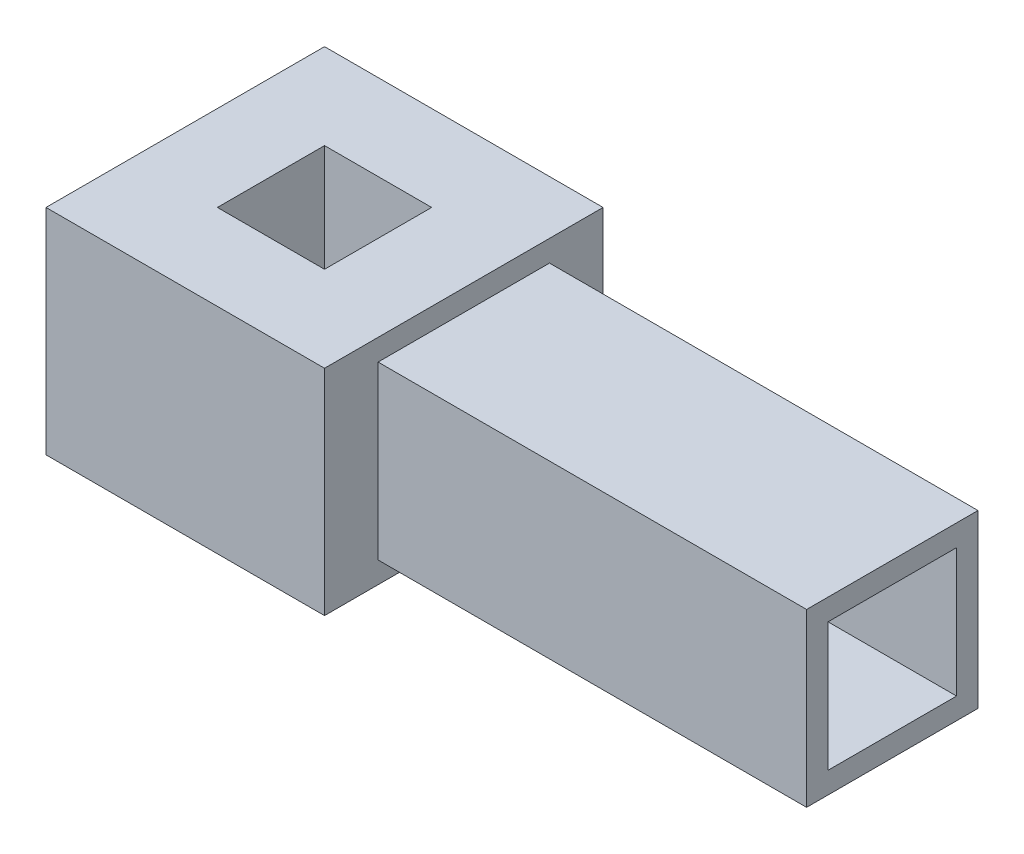
ISO-10303-21;
HEADER;
FILE_DESCRIPTION(('STEP AP214'),'2;1');
FILE_NAME('part.step','',(''),(''),'','','');
FILE_SCHEMA(('AUTOMOTIVE_DESIGN { 1 0 10303 214 1 1 1 1 }'));
ENDSEC;
DATA;
#1=APPLICATION_CONTEXT('core data for automotive mechanical design processes');
#2=APPLICATION_PROTOCOL_DEFINITION('international standard','automotive_design',2000,#1);
#3=PRODUCT_CONTEXT('',#1,'mechanical');
#4=PRODUCT('Part','Part','',(#3));
#5=PRODUCT_RELATED_PRODUCT_CATEGORY('part','',(#4));
#6=PRODUCT_DEFINITION_FORMATION('','',#4);
#7=PRODUCT_DEFINITION_CONTEXT('part definition',#1,'design');
#8=PRODUCT_DEFINITION('design','',#6,#7);
#9=PRODUCT_DEFINITION_SHAPE('','',#8);
#10=(LENGTH_UNIT() NAMED_UNIT(*) SI_UNIT(.MILLI.,.METRE.));
#11=(NAMED_UNIT(*) PLANE_ANGLE_UNIT() SI_UNIT($,.RADIAN.));
#12=(NAMED_UNIT(*) SI_UNIT($,.STERADIAN.) SOLID_ANGLE_UNIT());
#13=UNCERTAINTY_MEASURE_WITH_UNIT(LENGTH_MEASURE(1.E-05),#10,'distance_accuracy_value','');
#14=(GEOMETRIC_REPRESENTATION_CONTEXT(3) GLOBAL_UNCERTAINTY_ASSIGNED_CONTEXT((#13)) GLOBAL_UNIT_ASSIGNED_CONTEXT((#10,
#11,#12)) REPRESENTATION_CONTEXT('',''));
#15=CARTESIAN_POINT('',(0.,0.,0.));
#16=DIRECTION('',(0.,0.,1.));
#17=DIRECTION('',(1.,0.,0.));
#18=AXIS2_PLACEMENT_3D('',#15,#16,#17);
#19=CARTESIAN_POINT('',(32.5,50.,-32.5));
#20=DIRECTION('',(-1.,0.,0.));
#21=DIRECTION('',(0.,0.,1.));
#22=AXIS2_PLACEMENT_3D('',#19,#20,#21);
#23=PLANE('',#22);
#24=DIRECTION('',(0.,0.,-1.));
#25=VECTOR('',#24,1.);
#26=CARTESIAN_POINT('',(32.5,0.,-32.5));
#27=LINE('',#26,#25);
#28=CARTESIAN_POINT('',(32.5,0.,32.5));
#29=VERTEX_POINT('',#28);
#30=CARTESIAN_POINT('',(32.5,0.,-32.5));
#31=VERTEX_POINT('',#30);
#32=EDGE_CURVE('E256',#29,#31,#27,.T.);
#33=ORIENTED_EDGE('',*,*,#32,.T.);
#34=DIRECTION('',(0.,-1.,0.));
#35=VECTOR('',#34,1.);
#36=CARTESIAN_POINT('',(32.5,50.,-32.5));
#37=LINE('',#36,#35);
#38=CARTESIAN_POINT('',(32.5,50.,-32.5));
#39=VERTEX_POINT('',#38);
#40=EDGE_CURVE('E262',#39,#31,#37,.T.);
#41=ORIENTED_EDGE('',*,*,#40,.F.);
#42=DIRECTION('',(0.,0.,-1.));
#43=VECTOR('',#42,1.);
#44=CARTESIAN_POINT('',(32.5,50.,-32.5));
#45=LINE('',#44,#43);
#46=CARTESIAN_POINT('',(32.5,50.,32.5));
#47=VERTEX_POINT('',#46);
#48=EDGE_CURVE('E260',#47,#39,#45,.T.);
#49=ORIENTED_EDGE('',*,*,#48,.F.);
#50=DIRECTION('',(0.,-1.,0.));
#51=VECTOR('',#50,1.);
#52=CARTESIAN_POINT('',(32.5,50.,32.5));
#53=LINE('',#52,#51);
#54=EDGE_CURVE('E272',#47,#29,#53,.T.);
#55=ORIENTED_EDGE('',*,*,#54,.T.);
#56=EDGE_LOOP('',(#33,#41,#49,#55));
#57=FACE_BOUND('',#56,.T.);
#58=DIRECTION('',(0.,1.,0.));
#59=VECTOR('',#58,1.);
#60=CARTESIAN_POINT('',(32.5,45.,-20.));
#61=LINE('',#60,#59);
#62=CARTESIAN_POINT('',(32.5,5.,-20.));
#63=VERTEX_POINT('',#62);
#64=CARTESIAN_POINT('',(32.5,45.,-20.));
#65=VERTEX_POINT('',#64);
#66=EDGE_CURVE('E169',#63,#65,#61,.T.);
#67=ORIENTED_EDGE('',*,*,#66,.F.);
#68=DIRECTION('',(0.,0.,-1.));
#69=VECTOR('',#68,1.);
#70=CARTESIAN_POINT('',(32.5,5.,20.));
#71=LINE('',#70,#69);
#72=CARTESIAN_POINT('',(32.5,5.,20.));
#73=VERTEX_POINT('',#72);
#74=EDGE_CURVE('E197',#73,#63,#71,.T.);
#75=ORIENTED_EDGE('',*,*,#74,.F.);
#76=DIRECTION('',(0.,-1.,0.));
#77=VECTOR('',#76,1.);
#78=CARTESIAN_POINT('',(32.5,45.,20.));
#79=LINE('',#78,#77);
#80=CARTESIAN_POINT('',(32.5,45.,20.));
#81=VERTEX_POINT('',#80);
#82=EDGE_CURVE('E59',#81,#73,#79,.T.);
#83=ORIENTED_EDGE('',*,*,#82,.F.);
#84=DIRECTION('',(0.,0.,1.));
#85=VECTOR('',#84,1.);
#86=CARTESIAN_POINT('',(32.5,45.,20.));
#87=LINE('',#86,#85);
#88=EDGE_CURVE('E54',#65,#81,#87,.T.);
#89=ORIENTED_EDGE('',*,*,#88,.F.);
#90=EDGE_LOOP('',(#67,#75,#83,#89));
#91=FACE_BOUND('',#90,.T.);
#92=ADVANCED_FACE('F39',(#57,#91),#23,.F.);
#93=CARTESIAN_POINT('',(0.,50.,0.));
#94=DIRECTION('',(0.,-1.,0.));
#95=DIRECTION('',(0.,0.,-1.));
#96=AXIS2_PLACEMENT_3D('',#93,#94,#95);
#97=PLANE('',#96);
#98=DIRECTION('',(-1.,0.,0.));
#99=VECTOR('',#98,1.);
#100=CARTESIAN_POINT('',(-32.5,50.,-32.5));
#101=LINE('',#100,#99);
#102=CARTESIAN_POINT('',(-32.5,50.,-32.5));
#103=VERTEX_POINT('',#102);
#104=EDGE_CURVE('E252',#39,#103,#101,.T.);
#105=ORIENTED_EDGE('',*,*,#104,.T.);
#106=DIRECTION('',(0.,0.,1.));
#107=VECTOR('',#106,1.);
#108=CARTESIAN_POINT('',(-32.5,50.,-32.5));
#109=LINE('',#108,#107);
#110=CARTESIAN_POINT('',(-32.5,50.,32.5));
#111=VERTEX_POINT('',#110);
#112=EDGE_CURVE('E255',#103,#111,#109,.T.);
#113=ORIENTED_EDGE('',*,*,#112,.T.);
#114=DIRECTION('',(1.,0.,0.));
#115=VECTOR('',#114,1.);
#116=CARTESIAN_POINT('',(-32.5,50.,32.5));
#117=LINE('',#116,#115);
#118=EDGE_CURVE('E258',#111,#47,#117,.T.);
#119=ORIENTED_EDGE('',*,*,#118,.T.);
#120=ORIENTED_EDGE('',*,*,#48,.T.);
#121=EDGE_LOOP('',(#105,#113,#119,#120));
#122=FACE_BOUND('',#121,.T.);
#123=DIRECTION('',(0.,0.,-1.));
#124=VECTOR('',#123,1.);
#125=CARTESIAN_POINT('',(12.5,50.,-12.5));
#126=LINE('',#125,#124);
#127=CARTESIAN_POINT('',(12.5,50.,12.5));
#128=VERTEX_POINT('',#127);
#129=CARTESIAN_POINT('',(12.5,50.,-12.5));
#130=VERTEX_POINT('',#129);
#131=EDGE_CURVE('E221',#128,#130,#126,.T.);
#132=ORIENTED_EDGE('',*,*,#131,.F.);
#133=DIRECTION('',(1.,0.,0.));
#134=VECTOR('',#133,1.);
#135=CARTESIAN_POINT('',(-12.5,50.,12.5));
#136=LINE('',#135,#134);
#137=CARTESIAN_POINT('',(-12.5,50.,12.5));
#138=VERTEX_POINT('',#137);
#139=EDGE_CURVE('E229',#138,#128,#136,.T.);
#140=ORIENTED_EDGE('',*,*,#139,.F.);
#141=DIRECTION('',(0.,0.,1.));
#142=VECTOR('',#141,1.);
#143=CARTESIAN_POINT('',(-12.5,50.,-12.5));
#144=LINE('',#143,#142);
#145=CARTESIAN_POINT('',(-12.5,50.,-12.5));
#146=VERTEX_POINT('',#145);
#147=EDGE_CURVE('E226',#146,#138,#144,.T.);
#148=ORIENTED_EDGE('',*,*,#147,.F.);
#149=DIRECTION('',(-1.,0.,0.));
#150=VECTOR('',#149,1.);
#151=CARTESIAN_POINT('',(-12.5,50.,-12.5));
#152=LINE('',#151,#150);
#153=EDGE_CURVE('E223',#130,#146,#152,.T.);
#154=ORIENTED_EDGE('',*,*,#153,.F.);
#155=EDGE_LOOP('',(#132,#140,#148,#154));
#156=FACE_BOUND('',#155,.T.);
#157=ADVANCED_FACE('F294',(#122,#156),#97,.F.);
#158=CARTESIAN_POINT('',(0.,0.,0.));
#159=DIRECTION('',(0.,-1.,0.));
#160=DIRECTION('',(0.,0.,-1.));
#161=AXIS2_PLACEMENT_3D('',#158,#159,#160);
#162=PLANE('',#161);
#163=DIRECTION('',(-1.,0.,0.));
#164=VECTOR('',#163,1.);
#165=CARTESIAN_POINT('',(-32.5,0.,-32.5));
#166=LINE('',#165,#164);
#167=CARTESIAN_POINT('',(-32.5,0.,-32.5));
#168=VERTEX_POINT('',#167);
#169=EDGE_CURVE('E251',#31,#168,#166,.T.);
#170=ORIENTED_EDGE('',*,*,#169,.F.);
#171=ORIENTED_EDGE('',*,*,#32,.F.);
#172=DIRECTION('',(1.,0.,0.));
#173=VECTOR('',#172,1.);
#174=CARTESIAN_POINT('',(-32.5,0.,32.5));
#175=LINE('',#174,#173);
#176=CARTESIAN_POINT('',(-32.5,0.,32.5));
#177=VERTEX_POINT('',#176);
#178=EDGE_CURVE('E267',#177,#29,#175,.T.);
#179=ORIENTED_EDGE('',*,*,#178,.F.);
#180=DIRECTION('',(0.,0.,1.));
#181=VECTOR('',#180,1.);
#182=CARTESIAN_POINT('',(-32.5,0.,-32.5));
#183=LINE('',#182,#181);
#184=EDGE_CURVE('E265',#168,#177,#183,.T.);
#185=ORIENTED_EDGE('',*,*,#184,.F.);
#186=EDGE_LOOP('',(#170,#171,#179,#185));
#187=FACE_BOUND('',#186,.T.);
#188=DIRECTION('',(1.,0.,0.));
#189=VECTOR('',#188,1.);
#190=CARTESIAN_POINT('',(-12.5,0.,12.5));
#191=LINE('',#190,#189);
#192=CARTESIAN_POINT('',(-12.5,0.,12.5));
#193=VERTEX_POINT('',#192);
#194=CARTESIAN_POINT('',(12.5,0.,12.5));
#195=VERTEX_POINT('',#194);
#196=EDGE_CURVE('E224',#193,#195,#191,.T.);
#197=ORIENTED_EDGE('',*,*,#196,.T.);
#198=DIRECTION('',(0.,0.,-1.));
#199=VECTOR('',#198,1.);
#200=CARTESIAN_POINT('',(12.5,0.,-12.5));
#201=LINE('',#200,#199);
#202=CARTESIAN_POINT('',(12.5,0.,-12.5));
#203=VERTEX_POINT('',#202);
#204=EDGE_CURVE('E220',#195,#203,#201,.T.);
#205=ORIENTED_EDGE('',*,*,#204,.T.);
#206=DIRECTION('',(-1.,0.,0.));
#207=VECTOR('',#206,1.);
#208=CARTESIAN_POINT('',(-12.5,0.,-12.5));
#209=LINE('',#208,#207);
#210=CARTESIAN_POINT('',(-12.5,0.,-12.5));
#211=VERTEX_POINT('',#210);
#212=EDGE_CURVE('E234',#203,#211,#209,.T.);
#213=ORIENTED_EDGE('',*,*,#212,.T.);
#214=DIRECTION('',(0.,0.,1.));
#215=VECTOR('',#214,1.);
#216=CARTESIAN_POINT('',(-12.5,0.,-12.5));
#217=LINE('',#216,#215);
#218=EDGE_CURVE('E237',#211,#193,#217,.T.);
#219=ORIENTED_EDGE('',*,*,#218,.T.);
#220=EDGE_LOOP('',(#197,#205,#213,#219));
#221=FACE_BOUND('',#220,.T.);
#222=ADVANCED_FACE('F285',(#187,#221),#162,.T.);
#223=CARTESIAN_POINT('',(-32.5,50.,-32.5));
#224=DIRECTION('',(0.,0.,1.));
#225=DIRECTION('',(1.,0.,0.));
#226=AXIS2_PLACEMENT_3D('',#223,#224,#225);
#227=PLANE('',#226);
#228=ORIENTED_EDGE('',*,*,#169,.T.);
#229=DIRECTION('',(0.,-1.,0.));
#230=VECTOR('',#229,1.);
#231=CARTESIAN_POINT('',(-32.5,50.,-32.5));
#232=LINE('',#231,#230);
#233=EDGE_CURVE('E11',#103,#168,#232,.T.);
#234=ORIENTED_EDGE('',*,*,#233,.F.);
#235=ORIENTED_EDGE('',*,*,#104,.F.);
#236=ORIENTED_EDGE('',*,*,#40,.T.);
#237=EDGE_LOOP('',(#228,#234,#235,#236));
#238=FACE_BOUND('',#237,.T.);
#239=ADVANCED_FACE('F41',(#238),#227,.F.);
#240=CARTESIAN_POINT('',(-32.5,50.,-32.5));
#241=DIRECTION('',(1.,0.,0.));
#242=DIRECTION('',(0.,0.,-1.));
#243=AXIS2_PLACEMENT_3D('',#240,#241,#242);
#244=PLANE('',#243);
#245=ORIENTED_EDGE('',*,*,#184,.T.);
#246=DIRECTION('',(0.,-1.,0.));
#247=VECTOR('',#246,1.);
#248=CARTESIAN_POINT('',(-32.5,50.,32.5));
#249=LINE('',#248,#247);
#250=EDGE_CURVE('E47',#111,#177,#249,.T.);
#251=ORIENTED_EDGE('',*,*,#250,.F.);
#252=ORIENTED_EDGE('',*,*,#112,.F.);
#253=ORIENTED_EDGE('',*,*,#233,.T.);
#254=EDGE_LOOP('',(#245,#251,#252,#253));
#255=FACE_BOUND('',#254,.T.);
#256=ADVANCED_FACE('F296',(#255),#244,.F.);
#257=CARTESIAN_POINT('',(-32.5,50.,32.5));
#258=DIRECTION('',(0.,0.,-1.));
#259=DIRECTION('',(-1.,0.,0.));
#260=AXIS2_PLACEMENT_3D('',#257,#258,#259);
#261=PLANE('',#260);
#262=ORIENTED_EDGE('',*,*,#178,.T.);
#263=ORIENTED_EDGE('',*,*,#54,.F.);
#264=ORIENTED_EDGE('',*,*,#118,.F.);
#265=ORIENTED_EDGE('',*,*,#250,.T.);
#266=EDGE_LOOP('',(#262,#263,#264,#265));
#267=FACE_BOUND('',#266,.T.);
#268=ADVANCED_FACE('F279',(#267),#261,.F.);
#269=CARTESIAN_POINT('',(12.5,50.,-12.5));
#270=DIRECTION('',(-1.,0.,0.));
#271=DIRECTION('',(0.,0.,1.));
#272=AXIS2_PLACEMENT_3D('',#269,#270,#271);
#273=PLANE('',#272);
#274=ORIENTED_EDGE('',*,*,#204,.F.);
#275=DIRECTION('',(0.,-1.,0.));
#276=VECTOR('',#275,1.);
#277=CARTESIAN_POINT('',(12.5,50.,12.5));
#278=LINE('',#277,#276);
#279=EDGE_CURVE('E231',#128,#195,#278,.T.);
#280=ORIENTED_EDGE('',*,*,#279,.F.);
#281=ORIENTED_EDGE('',*,*,#131,.T.);
#282=DIRECTION('',(0.,-1.,0.));
#283=VECTOR('',#282,1.);
#284=CARTESIAN_POINT('',(12.5,50.,-12.5));
#285=LINE('',#284,#283);
#286=EDGE_CURVE('E248',#130,#203,#285,.T.);
#287=ORIENTED_EDGE('',*,*,#286,.T.);
#288=EDGE_LOOP('',(#274,#280,#281,#287));
#289=FACE_BOUND('',#288,.T.);
#290=ADVANCED_FACE('F302',(#289),#273,.T.);
#291=CARTESIAN_POINT('',(-12.5,50.,-12.5));
#292=DIRECTION('',(0.,0.,1.));
#293=DIRECTION('',(1.,0.,0.));
#294=AXIS2_PLACEMENT_3D('',#291,#292,#293);
#295=PLANE('',#294);
#296=ORIENTED_EDGE('',*,*,#212,.F.);
#297=ORIENTED_EDGE('',*,*,#286,.F.);
#298=ORIENTED_EDGE('',*,*,#153,.T.);
#299=DIRECTION('',(0.,-1.,0.));
#300=VECTOR('',#299,1.);
#301=CARTESIAN_POINT('',(-12.5,50.,-12.5));
#302=LINE('',#301,#300);
#303=EDGE_CURVE('E246',#146,#211,#302,.T.);
#304=ORIENTED_EDGE('',*,*,#303,.T.);
#305=EDGE_LOOP('',(#296,#297,#298,#304));
#306=FACE_BOUND('',#305,.T.);
#307=ADVANCED_FACE('F359',(#306),#295,.T.);
#308=CARTESIAN_POINT('',(-12.5,50.,-12.5));
#309=DIRECTION('',(1.,0.,0.));
#310=DIRECTION('',(0.,0.,-1.));
#311=AXIS2_PLACEMENT_3D('',#308,#309,#310);
#312=PLANE('',#311);
#313=ORIENTED_EDGE('',*,*,#218,.F.);
#314=ORIENTED_EDGE('',*,*,#303,.F.);
#315=ORIENTED_EDGE('',*,*,#147,.T.);
#316=DIRECTION('',(0.,-1.,0.));
#317=VECTOR('',#316,1.);
#318=CARTESIAN_POINT('',(-12.5,50.,12.5));
#319=LINE('',#318,#317);
#320=EDGE_CURVE('E244',#138,#193,#319,.T.);
#321=ORIENTED_EDGE('',*,*,#320,.T.);
#322=EDGE_LOOP('',(#313,#314,#315,#321));
#323=FACE_BOUND('',#322,.T.);
#324=ADVANCED_FACE('F355',(#323),#312,.T.);
#325=CARTESIAN_POINT('',(-12.5,50.,12.5));
#326=DIRECTION('',(0.,0.,-1.));
#327=DIRECTION('',(-1.,0.,0.));
#328=AXIS2_PLACEMENT_3D('',#325,#326,#327);
#329=PLANE('',#328);
#330=ORIENTED_EDGE('',*,*,#196,.F.);
#331=ORIENTED_EDGE('',*,*,#320,.F.);
#332=ORIENTED_EDGE('',*,*,#139,.T.);
#333=ORIENTED_EDGE('',*,*,#279,.T.);
#334=EDGE_LOOP('',(#330,#331,#332,#333));
#335=FACE_BOUND('',#334,.T.);
#336=ADVANCED_FACE('F338',(#335),#329,.T.);
#337=CARTESIAN_POINT('',(132.5,0.,0.));
#338=DIRECTION('',(1.,0.,0.));
#339=DIRECTION('',(0.,0.,-1.));
#340=AXIS2_PLACEMENT_3D('',#337,#338,#339);
#341=PLANE('',#340);
#342=DIRECTION('',(0.,1.,0.));
#343=VECTOR('',#342,1.);
#344=CARTESIAN_POINT('',(132.5,45.,-20.));
#345=LINE('',#344,#343);
#346=CARTESIAN_POINT('',(132.5,5.,-20.));
#347=VERTEX_POINT('',#346);
#348=CARTESIAN_POINT('',(132.5,45.,-20.));
#349=VERTEX_POINT('',#348);
#350=EDGE_CURVE('E193',#347,#349,#345,.T.);
#351=ORIENTED_EDGE('',*,*,#350,.T.);
#352=DIRECTION('',(0.,0.,1.));
#353=VECTOR('',#352,1.);
#354=CARTESIAN_POINT('',(132.5,45.,20.));
#355=LINE('',#354,#353);
#356=CARTESIAN_POINT('',(132.5,45.,20.));
#357=VERTEX_POINT('',#356);
#358=EDGE_CURVE('E196',#349,#357,#355,.T.);
#359=ORIENTED_EDGE('',*,*,#358,.T.);
#360=DIRECTION('',(0.,-1.,0.));
#361=VECTOR('',#360,1.);
#362=CARTESIAN_POINT('',(132.5,45.,20.));
#363=LINE('',#362,#361);
#364=CARTESIAN_POINT('',(132.5,5.,20.));
#365=VERTEX_POINT('',#364);
#366=EDGE_CURVE('E199',#357,#365,#363,.T.);
#367=ORIENTED_EDGE('',*,*,#366,.T.);
#368=DIRECTION('',(0.,0.,-1.));
#369=VECTOR('',#368,1.);
#370=CARTESIAN_POINT('',(132.5,5.,20.));
#371=LINE('',#370,#369);
#372=EDGE_CURVE('E201',#365,#347,#371,.T.);
#373=ORIENTED_EDGE('',*,*,#372,.T.);
#374=EDGE_LOOP('',(#351,#359,#367,#373));
#375=FACE_BOUND('',#374,.T.);
#376=DIRECTION('',(0.,0.,-1.));
#377=VECTOR('',#376,1.);
#378=CARTESIAN_POINT('',(132.5,10.,15.));
#379=LINE('',#378,#377);
#380=CARTESIAN_POINT('',(132.5,10.,15.));
#381=VERTEX_POINT('',#380);
#382=CARTESIAN_POINT('',(132.5,10.,-15.));
#383=VERTEX_POINT('',#382);
#384=EDGE_CURVE('E161',#381,#383,#379,.T.);
#385=ORIENTED_EDGE('',*,*,#384,.F.);
#386=DIRECTION('',(0.,-1.,0.));
#387=VECTOR('',#386,1.);
#388=CARTESIAN_POINT('',(132.5,40.,15.));
#389=LINE('',#388,#387);
#390=CARTESIAN_POINT('',(132.5,40.,15.));
#391=VERTEX_POINT('',#390);
#392=EDGE_CURVE('E151',#391,#381,#389,.T.);
#393=ORIENTED_EDGE('',*,*,#392,.F.);
#394=DIRECTION('',(0.,0.,1.));
#395=VECTOR('',#394,1.);
#396=CARTESIAN_POINT('',(132.5,40.,15.));
#397=LINE('',#396,#395);
#398=CARTESIAN_POINT('',(132.5,40.,-15.));
#399=VERTEX_POINT('',#398);
#400=EDGE_CURVE('E177',#399,#391,#397,.T.);
#401=ORIENTED_EDGE('',*,*,#400,.F.);
#402=DIRECTION('',(0.,1.,0.));
#403=VECTOR('',#402,1.);
#404=CARTESIAN_POINT('',(132.5,40.,-15.));
#405=LINE('',#404,#403);
#406=EDGE_CURVE('E175',#383,#399,#405,.T.);
#407=ORIENTED_EDGE('',*,*,#406,.F.);
#408=EDGE_LOOP('',(#385,#393,#401,#407));
#409=FACE_BOUND('',#408,.T.);
#410=ADVANCED_FACE('F173',(#375,#409),#341,.T.);
#411=CARTESIAN_POINT('',(132.5,45.,-20.));
#412=DIRECTION('',(0.,0.,1.));
#413=DIRECTION('',(1.,0.,0.));
#414=AXIS2_PLACEMENT_3D('',#411,#412,#413);
#415=PLANE('',#414);
#416=ORIENTED_EDGE('',*,*,#66,.T.);
#417=DIRECTION('',(-1.,0.,0.));
#418=VECTOR('',#417,1.);
#419=CARTESIAN_POINT('',(132.5,45.,-20.));
#420=LINE('',#419,#418);
#421=EDGE_CURVE('E218',#349,#65,#420,.T.);
#422=ORIENTED_EDGE('',*,*,#421,.F.);
#423=ORIENTED_EDGE('',*,*,#350,.F.);
#424=DIRECTION('',(-1.,0.,0.));
#425=VECTOR('',#424,1.);
#426=CARTESIAN_POINT('',(132.5,5.,-20.));
#427=LINE('',#426,#425);
#428=EDGE_CURVE('E203',#347,#63,#427,.T.);
#429=ORIENTED_EDGE('',*,*,#428,.T.);
#430=EDGE_LOOP('',(#416,#422,#423,#429));
#431=FACE_BOUND('',#430,.T.);
#432=ADVANCED_FACE('F337',(#431),#415,.F.);
#433=CARTESIAN_POINT('',(132.5,45.,20.));
#434=DIRECTION('',(0.,-1.,0.));
#435=DIRECTION('',(0.,0.,-1.));
#436=AXIS2_PLACEMENT_3D('',#433,#434,#435);
#437=PLANE('',#436);
#438=ORIENTED_EDGE('',*,*,#88,.T.);
#439=DIRECTION('',(-1.,0.,0.));
#440=VECTOR('',#439,1.);
#441=CARTESIAN_POINT('',(132.5,45.,20.));
#442=LINE('',#441,#440);
#443=EDGE_CURVE('E215',#357,#81,#442,.T.);
#444=ORIENTED_EDGE('',*,*,#443,.F.);
#445=ORIENTED_EDGE('',*,*,#358,.F.);
#446=ORIENTED_EDGE('',*,*,#421,.T.);
#447=EDGE_LOOP('',(#438,#444,#445,#446));
#448=FACE_BOUND('',#447,.T.);
#449=ADVANCED_FACE('F346',(#448),#437,.F.);
#450=CARTESIAN_POINT('',(132.5,45.,20.));
#451=DIRECTION('',(0.,0.,-1.));
#452=DIRECTION('',(-1.,0.,0.));
#453=AXIS2_PLACEMENT_3D('',#450,#451,#452);
#454=PLANE('',#453);
#455=ORIENTED_EDGE('',*,*,#82,.T.);
#456=DIRECTION('',(-1.,0.,0.));
#457=VECTOR('',#456,1.);
#458=CARTESIAN_POINT('',(132.5,5.,20.));
#459=LINE('',#458,#457);
#460=EDGE_CURVE('E212',#365,#73,#459,.T.);
#461=ORIENTED_EDGE('',*,*,#460,.F.);
#462=ORIENTED_EDGE('',*,*,#366,.F.);
#463=ORIENTED_EDGE('',*,*,#443,.T.);
#464=EDGE_LOOP('',(#455,#461,#462,#463));
#465=FACE_BOUND('',#464,.T.);
#466=ADVANCED_FACE('F342',(#465),#454,.F.);
#467=CARTESIAN_POINT('',(132.5,5.,20.));
#468=DIRECTION('',(0.,1.,0.));
#469=DIRECTION('',(0.,0.,1.));
#470=AXIS2_PLACEMENT_3D('',#467,#468,#469);
#471=PLANE('',#470);
#472=ORIENTED_EDGE('',*,*,#74,.T.);
#473=ORIENTED_EDGE('',*,*,#428,.F.);
#474=ORIENTED_EDGE('',*,*,#372,.F.);
#475=ORIENTED_EDGE('',*,*,#460,.T.);
#476=EDGE_LOOP('',(#472,#473,#474,#475));
#477=FACE_BOUND('',#476,.T.);
#478=ADVANCED_FACE('F335',(#477),#471,.F.);
#479=CARTESIAN_POINT('',(132.5,40.,15.));
#480=DIRECTION('',(0.,0.,-1.));
#481=DIRECTION('',(-1.,0.,0.));
#482=AXIS2_PLACEMENT_3D('',#479,#480,#481);
#483=PLANE('',#482);
#484=DIRECTION('',(0.,-1.,0.));
#485=VECTOR('',#484,1.);
#486=CARTESIAN_POINT('',(32.5,40.,15.));
#487=LINE('',#486,#485);
#488=CARTESIAN_POINT('',(32.5,40.,15.));
#489=VERTEX_POINT('',#488);
#490=CARTESIAN_POINT('',(32.5,10.,15.));
#491=VERTEX_POINT('',#490);
#492=EDGE_CURVE('E181',#489,#491,#487,.T.);
#493=ORIENTED_EDGE('',*,*,#492,.F.);
#494=DIRECTION('',(-1.,0.,0.));
#495=VECTOR('',#494,1.);
#496=CARTESIAN_POINT('',(132.5,40.,15.));
#497=LINE('',#496,#495);
#498=EDGE_CURVE('E157',#391,#489,#497,.T.);
#499=ORIENTED_EDGE('',*,*,#498,.F.);
#500=ORIENTED_EDGE('',*,*,#392,.T.);
#501=DIRECTION('',(-1.,0.,0.));
#502=VECTOR('',#501,1.);
#503=CARTESIAN_POINT('',(132.5,10.,15.));
#504=LINE('',#503,#502);
#505=EDGE_CURVE('E155',#381,#491,#504,.T.);
#506=ORIENTED_EDGE('',*,*,#505,.T.);
#507=EDGE_LOOP('',(#493,#499,#500,#506));
#508=FACE_BOUND('',#507,.T.);
#509=ADVANCED_FACE('F154',(#508),#483,.T.);
#510=CARTESIAN_POINT('',(132.5,10.,15.));
#511=DIRECTION('',(0.,1.,0.));
#512=DIRECTION('',(0.,0.,1.));
#513=AXIS2_PLACEMENT_3D('',#510,#511,#512);
#514=PLANE('',#513);
#515=DIRECTION('',(0.,0.,-1.));
#516=VECTOR('',#515,1.);
#517=CARTESIAN_POINT('',(32.5,10.,15.));
#518=LINE('',#517,#516);
#519=CARTESIAN_POINT('',(32.5,10.,-15.));
#520=VERTEX_POINT('',#519);
#521=EDGE_CURVE('E168',#491,#520,#518,.T.);
#522=ORIENTED_EDGE('',*,*,#521,.F.);
#523=ORIENTED_EDGE('',*,*,#505,.F.);
#524=ORIENTED_EDGE('',*,*,#384,.T.);
#525=DIRECTION('',(-1.,0.,0.));
#526=VECTOR('',#525,1.);
#527=CARTESIAN_POINT('',(132.5,10.,-15.));
#528=LINE('',#527,#526);
#529=EDGE_CURVE('E170',#383,#520,#528,.T.);
#530=ORIENTED_EDGE('',*,*,#529,.T.);
#531=EDGE_LOOP('',(#522,#523,#524,#530));
#532=FACE_BOUND('',#531,.T.);
#533=ADVANCED_FACE('F165',(#532),#514,.T.);
#534=CARTESIAN_POINT('',(132.5,40.,-15.));
#535=DIRECTION('',(0.,0.,1.));
#536=DIRECTION('',(0.,-1.,0.));
#537=AXIS2_PLACEMENT_3D('',#534,#535,#536);
#538=PLANE('',#537);
#539=DIRECTION('',(0.,1.,0.));
#540=VECTOR('',#539,1.);
#541=CARTESIAN_POINT('',(32.5,40.,-15.));
#542=LINE('',#541,#540);
#543=CARTESIAN_POINT('',(32.5,40.,-15.));
#544=VERTEX_POINT('',#543);
#545=EDGE_CURVE('E184',#520,#544,#542,.T.);
#546=ORIENTED_EDGE('',*,*,#545,.F.);
#547=ORIENTED_EDGE('',*,*,#529,.F.);
#548=ORIENTED_EDGE('',*,*,#406,.T.);
#549=DIRECTION('',(-1.,0.,0.));
#550=VECTOR('',#549,1.);
#551=CARTESIAN_POINT('',(132.5,40.,-15.));
#552=LINE('',#551,#550);
#553=EDGE_CURVE('E190',#399,#544,#552,.T.);
#554=ORIENTED_EDGE('',*,*,#553,.T.);
#555=EDGE_LOOP('',(#546,#547,#548,#554));
#556=FACE_BOUND('',#555,.T.);
#557=ADVANCED_FACE('F320',(#556),#538,.T.);
#558=CARTESIAN_POINT('',(132.5,40.,15.));
#559=DIRECTION('',(0.,-1.,0.));
#560=DIRECTION('',(0.,0.,-1.));
#561=AXIS2_PLACEMENT_3D('',#558,#559,#560);
#562=PLANE('',#561);
#563=DIRECTION('',(0.,0.,1.));
#564=VECTOR('',#563,1.);
#565=CARTESIAN_POINT('',(32.5,40.,15.));
#566=LINE('',#565,#564);
#567=EDGE_CURVE('E162',#544,#489,#566,.T.);
#568=ORIENTED_EDGE('',*,*,#567,.F.);
#569=ORIENTED_EDGE('',*,*,#553,.F.);
#570=ORIENTED_EDGE('',*,*,#400,.T.);
#571=ORIENTED_EDGE('',*,*,#498,.T.);
#572=EDGE_LOOP('',(#568,#569,#570,#571));
#573=FACE_BOUND('',#572,.T.);
#574=ADVANCED_FACE('F315',(#573),#562,.T.);
#575=ORIENTED_EDGE('',*,*,#567,.T.);
#576=ORIENTED_EDGE('',*,*,#492,.T.);
#577=ORIENTED_EDGE('',*,*,#521,.T.);
#578=ORIENTED_EDGE('',*,*,#545,.T.);
#579=EDGE_LOOP('',(#575,#576,#577,#578));
#580=FACE_BOUND('',#579,.T.);
#581=ADVANCED_FACE('F306',(#580),#23,.F.);
#582=CLOSED_SHELL('',(#92,#157,#222,#239,#256,#268,#290,#307,#324,#336,#410,#432,#449,#466,#478,
#509,#533,#557,#574,#581));
#583=MANIFOLD_SOLID_BREP('B2',#582);
#584=ADVANCED_BREP_SHAPE_REPRESENTATION('',(#18,#583),#14);
#585=SHAPE_DEFINITION_REPRESENTATION(#9,#584);
ENDSEC;
END-ISO-10303-21;
